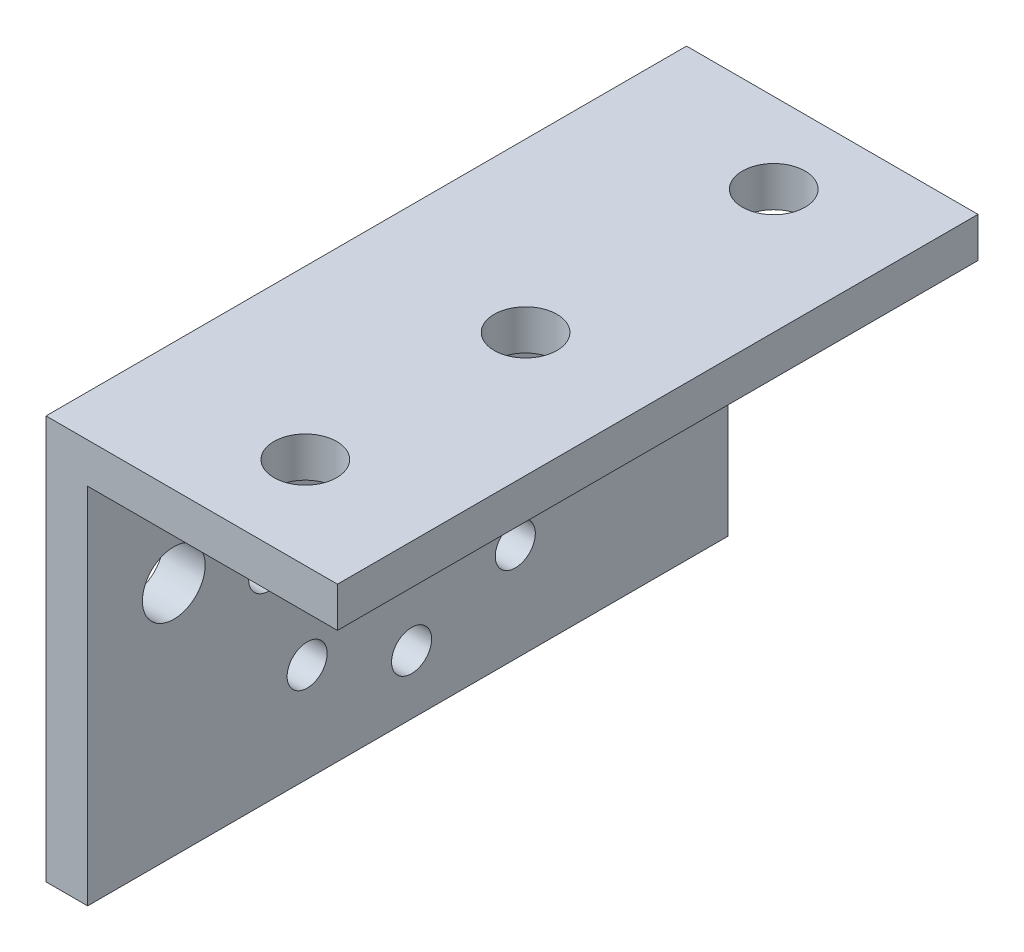
ISO-10303-21;
HEADER;
FILE_DESCRIPTION(('STEP AP214'),'2;1');
FILE_NAME('part.step','',(''),(''),'','','');
FILE_SCHEMA(('AUTOMOTIVE_DESIGN { 1 0 10303 214 1 1 1 1 }'));
ENDSEC;
DATA;
#1=APPLICATION_CONTEXT('core data for automotive mechanical design processes');
#2=APPLICATION_PROTOCOL_DEFINITION('international standard','automotive_design',2000,#1);
#3=PRODUCT_CONTEXT('',#1,'mechanical');
#4=PRODUCT('Part','Part','',(#3));
#5=PRODUCT_RELATED_PRODUCT_CATEGORY('part','',(#4));
#6=PRODUCT_DEFINITION_FORMATION('','',#4);
#7=PRODUCT_DEFINITION_CONTEXT('part definition',#1,'design');
#8=PRODUCT_DEFINITION('design','',#6,#7);
#9=PRODUCT_DEFINITION_SHAPE('','',#8);
#10=(LENGTH_UNIT() NAMED_UNIT(*) SI_UNIT(.MILLI.,.METRE.));
#11=(NAMED_UNIT(*) PLANE_ANGLE_UNIT() SI_UNIT($,.RADIAN.));
#12=(NAMED_UNIT(*) SI_UNIT($,.STERADIAN.) SOLID_ANGLE_UNIT());
#13=UNCERTAINTY_MEASURE_WITH_UNIT(LENGTH_MEASURE(1.E-05),#10,'distance_accuracy_value','');
#14=(GEOMETRIC_REPRESENTATION_CONTEXT(3) GLOBAL_UNCERTAINTY_ASSIGNED_CONTEXT((#13)) GLOBAL_UNIT_ASSIGNED_CONTEXT((#10,
#11,#12)) REPRESENTATION_CONTEXT('',''));
#15=CARTESIAN_POINT('',(0.,0.,0.));
#16=DIRECTION('',(0.,0.,1.));
#17=DIRECTION('',(1.,0.,0.));
#18=AXIS2_PLACEMENT_3D('',#15,#16,#17);
#19=CARTESIAN_POINT('',(0.,0.,50.8));
#20=DIRECTION('',(1.,0.,0.));
#21=DIRECTION('',(0.,0.,-1.));
#22=AXIS2_PLACEMENT_3D('',#19,#20,#21);
#23=PLANE('',#22);
#24=CARTESIAN_POINT('',(0.,27.3621465067313,25.1090568968444));
#25=DIRECTION('',(-1.,0.,0.));
#26=DIRECTION('',(0.,0.,1.));
#27=AXIS2_PLACEMENT_3D('',#24,#25,#26);
#28=CIRCLE('',#27,1.5875);
#29=CARTESIAN_POINT('',(0.,27.3621465067313,26.6965568968444));
#30=VERTEX_POINT('',#29);
#31=EDGE_CURVE('E170',#30,#30,#28,.T.);
#32=ORIENTED_EDGE('',*,*,#31,.F.);
#33=EDGE_LOOP('',(#32));
#34=FACE_BOUND('',#33,.T.);
#35=DIRECTION('',(0.,-1.,0.));
#36=VECTOR('',#35,1.);
#37=CARTESIAN_POINT('',(0.,0.,0.));
#38=LINE('',#37,#36);
#39=CARTESIAN_POINT('',(0.,32.004,0.));
#40=VERTEX_POINT('',#39);
#41=CARTESIAN_POINT('',(0.,0.,0.));
#42=VERTEX_POINT('',#41);
#43=EDGE_CURVE('E87',#40,#42,#38,.T.);
#44=ORIENTED_EDGE('',*,*,#43,.T.);
#45=DIRECTION('',(0.,0.,-1.));
#46=VECTOR('',#45,1.);
#47=CARTESIAN_POINT('',(0.,0.,50.8));
#48=LINE('',#47,#46);
#49=CARTESIAN_POINT('',(0.,0.,50.8));
#50=VERTEX_POINT('',#49);
#51=EDGE_CURVE('E128',#50,#42,#48,.T.);
#52=ORIENTED_EDGE('',*,*,#51,.F.);
#53=DIRECTION('',(0.,-1.,0.));
#54=VECTOR('',#53,1.);
#55=CARTESIAN_POINT('',(0.,0.,50.8));
#56=LINE('',#55,#54);
#57=CARTESIAN_POINT('',(0.,32.004,50.8));
#58=VERTEX_POINT('',#57);
#59=EDGE_CURVE('E60',#58,#50,#56,.T.);
#60=ORIENTED_EDGE('',*,*,#59,.F.);
#61=DIRECTION('',(0.,0.,-1.));
#62=VECTOR('',#61,1.);
#63=CARTESIAN_POINT('',(0.,32.004,50.8));
#64=LINE('',#63,#62);
#65=EDGE_CURVE('E124',#58,#40,#64,.T.);
#66=ORIENTED_EDGE('',*,*,#65,.T.);
#67=EDGE_LOOP('',(#44,#52,#60,#66));
#68=FACE_BOUND('',#67,.T.);
#69=CARTESIAN_POINT('',(0.,18.7616832923823,43.9669366542612));
#70=DIRECTION('',(-1.,0.,0.));
#71=DIRECTION('',(0.,0.,1.));
#72=AXIS2_PLACEMENT_3D('',#69,#70,#71);
#73=CIRCLE('',#72,2.4892);
#74=CARTESIAN_POINT('',(0.,18.7616832923823,46.4561366542612));
#75=VERTEX_POINT('',#74);
#76=EDGE_CURVE('E194',#75,#75,#73,.T.);
#77=ORIENTED_EDGE('',*,*,#76,.F.);
#78=EDGE_LOOP('',(#77));
#79=FACE_BOUND('',#78,.T.);
#80=CARTESIAN_POINT('',(0.,18.7616832923823,26.2056359254256));
#81=DIRECTION('',(-1.,0.,0.));
#82=DIRECTION('',(0.,0.,1.));
#83=AXIS2_PLACEMENT_3D('',#80,#81,#82);
#84=CIRCLE('',#83,2.4892);
#85=CARTESIAN_POINT('',(0.,18.7616832923823,28.6948359254256));
#86=VERTEX_POINT('',#85);
#87=EDGE_CURVE('E188',#86,#86,#84,.T.);
#88=ORIENTED_EDGE('',*,*,#87,.F.);
#89=EDGE_LOOP('',(#88));
#90=FACE_BOUND('',#89,.T.);
#91=CARTESIAN_POINT('',(0.,18.7616832923823,6.28968559997728));
#92=DIRECTION('',(-1.,0.,0.));
#93=DIRECTION('',(0.,0.,1.));
#94=AXIS2_PLACEMENT_3D('',#91,#92,#93);
#95=CIRCLE('',#94,2.4892);
#96=CARTESIAN_POINT('',(0.,18.7616832923823,8.77888559997728));
#97=VERTEX_POINT('',#96);
#98=EDGE_CURVE('E182',#97,#97,#95,.T.);
#99=ORIENTED_EDGE('',*,*,#98,.F.);
#100=EDGE_LOOP('',(#99));
#101=FACE_BOUND('',#100,.T.);
#102=CARTESIAN_POINT('',(0.,24.2925650484884,33.3929914732565));
#103=DIRECTION('',(-1.,0.,0.));
#104=DIRECTION('',(0.,0.,1.));
#105=AXIS2_PLACEMENT_3D('',#102,#103,#104);
#106=CIRCLE('',#105,1.5875);
#107=CARTESIAN_POINT('',(0.,24.2925650484884,34.9804914732565));
#108=VERTEX_POINT('',#107);
#109=EDGE_CURVE('E169',#108,#108,#106,.T.);
#110=ORIENTED_EDGE('',*,*,#109,.F.);
#111=EDGE_LOOP('',(#110));
#112=FACE_BOUND('',#111,.T.);
#113=CARTESIAN_POINT('',(0.,24.2925650484884,16.8841527330909));
#114=DIRECTION('',(-1.,0.,0.));
#115=DIRECTION('',(0.,0.,1.));
#116=AXIS2_PLACEMENT_3D('',#113,#114,#115);
#117=CIRCLE('',#116,1.5875);
#118=CARTESIAN_POINT('',(0.,24.2925650484884,18.4716527330908));
#119=VERTEX_POINT('',#118);
#120=EDGE_CURVE('E303',#119,#119,#117,.T.);
#121=ORIENTED_EDGE('',*,*,#120,.F.);
#122=EDGE_LOOP('',(#121));
#123=FACE_BOUND('',#122,.T.);
#124=CARTESIAN_POINT('',(0.,16.0283072762958,13.7948944706284));
#125=DIRECTION('',(-1.,0.,0.));
#126=DIRECTION('',(0.,0.,1.));
#127=AXIS2_PLACEMENT_3D('',#124,#125,#126);
#128=CIRCLE('',#127,1.5875);
#129=CARTESIAN_POINT('',(0.,16.0283072762958,15.3823944706284));
#130=VERTEX_POINT('',#129);
#131=EDGE_CURVE('E307',#130,#130,#128,.T.);
#132=ORIENTED_EDGE('',*,*,#131,.F.);
#133=EDGE_LOOP('',(#132));
#134=FACE_BOUND('',#133,.T.);
#135=CARTESIAN_POINT('',(0.,7.84275672098125,16.8841527330909));
#136=DIRECTION('',(-1.,0.,0.));
#137=DIRECTION('',(0.,0.,1.));
#138=AXIS2_PLACEMENT_3D('',#135,#136,#137);
#139=CIRCLE('',#138,1.5875);
#140=CARTESIAN_POINT('',(0.,7.84275672098125,18.4716527330908));
#141=VERTEX_POINT('',#140);
#142=EDGE_CURVE('E311',#141,#141,#139,.T.);
#143=ORIENTED_EDGE('',*,*,#142,.F.);
#144=EDGE_LOOP('',(#143));
#145=FACE_BOUND('',#144,.T.);
#146=CARTESIAN_POINT('',(0.,4.69446804586027,25.1090568968444));
#147=DIRECTION('',(-1.,0.,0.));
#148=DIRECTION('',(0.,0.,1.));
#149=AXIS2_PLACEMENT_3D('',#146,#147,#148);
#150=CIRCLE('',#149,1.5875);
#151=CARTESIAN_POINT('',(0.,4.69446804586027,26.6965568968444));
#152=VERTEX_POINT('',#151);
#153=EDGE_CURVE('E315',#152,#152,#150,.T.);
#154=ORIENTED_EDGE('',*,*,#153,.F.);
#155=EDGE_LOOP('',(#154));
#156=FACE_BOUND('',#155,.T.);
#157=CARTESIAN_POINT('',(0.,7.84275672098125,33.3929914732565));
#158=DIRECTION('',(-1.,0.,0.));
#159=DIRECTION('',(0.,0.,1.));
#160=AXIS2_PLACEMENT_3D('',#157,#158,#159);
#161=CIRCLE('',#160,1.5875);
#162=CARTESIAN_POINT('',(0.,7.84275672098125,34.9804914732565));
#163=VERTEX_POINT('',#162);
#164=EDGE_CURVE('E319',#163,#163,#161,.T.);
#165=ORIENTED_EDGE('',*,*,#164,.F.);
#166=EDGE_LOOP('',(#165));
#167=FACE_BOUND('',#166,.T.);
#168=CARTESIAN_POINT('',(0.,16.0283072762958,36.4428961272799));
#169=DIRECTION('',(-1.,0.,0.));
#170=DIRECTION('',(0.,0.,1.));
#171=AXIS2_PLACEMENT_3D('',#168,#169,#170);
#172=CIRCLE('',#171,1.5875);
#173=CARTESIAN_POINT('',(0.,16.0283072762958,38.0303961272799));
#174=VERTEX_POINT('',#173);
#175=EDGE_CURVE('E322',#174,#174,#172,.T.);
#176=ORIENTED_EDGE('',*,*,#175,.F.);
#177=EDGE_LOOP('',(#176));
#178=FACE_BOUND('',#177,.T.);
#179=ADVANCED_FACE('F37',(#34,#68,#79,#90,#101,#112,#123,#134,#145,#156,#167,#178),#23,.F.);
#180=CARTESIAN_POINT('',(0.,0.,50.8));
#181=DIRECTION('',(0.,1.,0.));
#182=DIRECTION('',(0.,0.,1.));
#183=AXIS2_PLACEMENT_3D('',#180,#181,#182);
#184=PLANE('',#183);
#185=DIRECTION('',(1.,0.,0.));
#186=VECTOR('',#185,1.);
#187=CARTESIAN_POINT('',(0.,0.,0.));
#188=LINE('',#187,#186);
#189=CARTESIAN_POINT('',(3.302,0.,0.));
#190=VERTEX_POINT('',#189);
#191=EDGE_CURVE('E132',#42,#190,#188,.T.);
#192=ORIENTED_EDGE('',*,*,#191,.T.);
#193=DIRECTION('',(0.,0.,-1.));
#194=VECTOR('',#193,1.);
#195=CARTESIAN_POINT('',(3.302,0.,50.8));
#196=LINE('',#195,#194);
#197=CARTESIAN_POINT('',(3.302,0.,50.8));
#198=VERTEX_POINT('',#197);
#199=EDGE_CURVE('E45',#198,#190,#196,.T.);
#200=ORIENTED_EDGE('',*,*,#199,.F.);
#201=DIRECTION('',(1.,0.,0.));
#202=VECTOR('',#201,1.);
#203=CARTESIAN_POINT('',(0.,0.,50.8));
#204=LINE('',#203,#202);
#205=EDGE_CURVE('E145',#50,#198,#204,.T.);
#206=ORIENTED_EDGE('',*,*,#205,.F.);
#207=ORIENTED_EDGE('',*,*,#51,.T.);
#208=EDGE_LOOP('',(#192,#200,#206,#207));
#209=FACE_BOUND('',#208,.T.);
#210=ADVANCED_FACE('F39',(#209),#184,.F.);
#211=CARTESIAN_POINT('',(3.302,0.,50.8));
#212=DIRECTION('',(-1.,0.,0.));
#213=DIRECTION('',(0.,0.,1.));
#214=AXIS2_PLACEMENT_3D('',#211,#212,#213);
#215=PLANE('',#214);
#216=CARTESIAN_POINT('',(3.302,16.0283072762958,36.4428961272799));
#217=DIRECTION('',(-1.,0.,0.));
#218=DIRECTION('',(0.,0.,1.));
#219=AXIS2_PLACEMENT_3D('',#216,#217,#218);
#220=CIRCLE('',#219,1.5875);
#221=CARTESIAN_POINT('',(3.302,16.0283072762958,38.0303961272799));
#222=VERTEX_POINT('',#221);
#223=EDGE_CURVE('E258',#222,#222,#220,.T.);
#224=ORIENTED_EDGE('',*,*,#223,.T.);
#225=EDGE_LOOP('',(#224));
#226=FACE_BOUND('',#225,.T.);
#227=CARTESIAN_POINT('',(3.302,7.84275672098125,33.3929914732565));
#228=DIRECTION('',(-1.,0.,0.));
#229=DIRECTION('',(0.,0.,1.));
#230=AXIS2_PLACEMENT_3D('',#227,#228,#229);
#231=CIRCLE('',#230,1.5875);
#232=CARTESIAN_POINT('',(3.302,7.84275672098125,34.9804914732565));
#233=VERTEX_POINT('',#232);
#234=EDGE_CURVE('E262',#233,#233,#231,.T.);
#235=ORIENTED_EDGE('',*,*,#234,.T.);
#236=EDGE_LOOP('',(#235));
#237=FACE_BOUND('',#236,.T.);
#238=CARTESIAN_POINT('',(3.302,4.69446804586027,25.1090568968444));
#239=DIRECTION('',(-1.,0.,0.));
#240=DIRECTION('',(0.,0.,1.));
#241=AXIS2_PLACEMENT_3D('',#238,#239,#240);
#242=CIRCLE('',#241,1.5875);
#243=CARTESIAN_POINT('',(3.302,4.69446804586027,26.6965568968444));
#244=VERTEX_POINT('',#243);
#245=EDGE_CURVE('E266',#244,#244,#242,.T.);
#246=ORIENTED_EDGE('',*,*,#245,.T.);
#247=EDGE_LOOP('',(#246));
#248=FACE_BOUND('',#247,.T.);
#249=CARTESIAN_POINT('',(3.302,7.84275672098125,16.8841527330909));
#250=DIRECTION('',(-1.,0.,0.));
#251=DIRECTION('',(0.,0.,1.));
#252=AXIS2_PLACEMENT_3D('',#249,#250,#251);
#253=CIRCLE('',#252,1.5875);
#254=CARTESIAN_POINT('',(3.302,7.84275672098125,18.4716527330908));
#255=VERTEX_POINT('',#254);
#256=EDGE_CURVE('E270',#255,#255,#253,.T.);
#257=ORIENTED_EDGE('',*,*,#256,.T.);
#258=EDGE_LOOP('',(#257));
#259=FACE_BOUND('',#258,.T.);
#260=CARTESIAN_POINT('',(3.302,16.0283072762958,13.7948944706284));
#261=DIRECTION('',(-1.,0.,0.));
#262=DIRECTION('',(0.,0.,1.));
#263=AXIS2_PLACEMENT_3D('',#260,#261,#262);
#264=CIRCLE('',#263,1.5875);
#265=CARTESIAN_POINT('',(3.302,16.0283072762958,15.3823944706284));
#266=VERTEX_POINT('',#265);
#267=EDGE_CURVE('E274',#266,#266,#264,.T.);
#268=ORIENTED_EDGE('',*,*,#267,.T.);
#269=EDGE_LOOP('',(#268));
#270=FACE_BOUND('',#269,.T.);
#271=CARTESIAN_POINT('',(3.302,24.2925650484884,16.8841527330909));
#272=DIRECTION('',(-1.,0.,0.));
#273=DIRECTION('',(0.,0.,1.));
#274=AXIS2_PLACEMENT_3D('',#271,#272,#273);
#275=CIRCLE('',#274,1.5875);
#276=CARTESIAN_POINT('',(3.302,24.2925650484884,18.4716527330908));
#277=VERTEX_POINT('',#276);
#278=EDGE_CURVE('E176',#277,#277,#275,.T.);
#279=ORIENTED_EDGE('',*,*,#278,.T.);
#280=EDGE_LOOP('',(#279));
#281=FACE_BOUND('',#280,.T.);
#282=CARTESIAN_POINT('',(3.302,24.2925650484884,33.3929914732565));
#283=DIRECTION('',(-1.,0.,0.));
#284=DIRECTION('',(0.,0.,1.));
#285=AXIS2_PLACEMENT_3D('',#282,#283,#284);
#286=CIRCLE('',#285,1.5875);
#287=CARTESIAN_POINT('',(3.302,24.2925650484884,34.9804914732565));
#288=VERTEX_POINT('',#287);
#289=EDGE_CURVE('E173',#288,#288,#286,.T.);
#290=ORIENTED_EDGE('',*,*,#289,.T.);
#291=EDGE_LOOP('',(#290));
#292=FACE_BOUND('',#291,.T.);
#293=CARTESIAN_POINT('',(3.302,18.7616832923823,6.28968559997728));
#294=DIRECTION('',(-1.,0.,0.));
#295=DIRECTION('',(0.,0.,1.));
#296=AXIS2_PLACEMENT_3D('',#293,#294,#295);
#297=CIRCLE('',#296,2.4892);
#298=CARTESIAN_POINT('',(3.302,18.7616832923823,8.77888559997728));
#299=VERTEX_POINT('',#298);
#300=EDGE_CURVE('E185',#299,#299,#297,.T.);
#301=ORIENTED_EDGE('',*,*,#300,.T.);
#302=EDGE_LOOP('',(#301));
#303=FACE_BOUND('',#302,.T.);
#304=CARTESIAN_POINT('',(3.302,18.7616832923823,26.2056359254256));
#305=DIRECTION('',(-1.,0.,0.));
#306=DIRECTION('',(0.,0.,1.));
#307=AXIS2_PLACEMENT_3D('',#304,#305,#306);
#308=CIRCLE('',#307,2.4892);
#309=CARTESIAN_POINT('',(3.302,18.7616832923823,28.6948359254256));
#310=VERTEX_POINT('',#309);
#311=EDGE_CURVE('E191',#310,#310,#308,.T.);
#312=ORIENTED_EDGE('',*,*,#311,.T.);
#313=EDGE_LOOP('',(#312));
#314=FACE_BOUND('',#313,.T.);
#315=CARTESIAN_POINT('',(3.302,18.7616832923823,43.9669366542612));
#316=DIRECTION('',(-1.,0.,0.));
#317=DIRECTION('',(0.,0.,1.));
#318=AXIS2_PLACEMENT_3D('',#315,#316,#317);
#319=CIRCLE('',#318,2.4892);
#320=CARTESIAN_POINT('',(3.302,18.7616832923823,46.4561366542612));
#321=VERTEX_POINT('',#320);
#322=EDGE_CURVE('E197',#321,#321,#319,.T.);
#323=ORIENTED_EDGE('',*,*,#322,.T.);
#324=EDGE_LOOP('',(#323));
#325=FACE_BOUND('',#324,.T.);
#326=DIRECTION('',(0.,0.,-1.));
#327=VECTOR('',#326,1.);
#328=CARTESIAN_POINT('',(3.302,28.829,50.8));
#329=LINE('',#328,#327);
#330=CARTESIAN_POINT('',(3.302,28.829,24.502017294112));
#331=VERTEX_POINT('',#330);
#332=CARTESIAN_POINT('',(3.302,28.829,0.));
#333=VERTEX_POINT('',#332);
#334=EDGE_CURVE('E149',#331,#333,#329,.T.);
#335=ORIENTED_EDGE('',*,*,#334,.F.);
#336=CARTESIAN_POINT('',(3.302,27.3621465067313,25.1090568968444));
#337=DIRECTION('',(-1.,0.,0.));
#338=DIRECTION('',(0.,0.,1.));
#339=AXIS2_PLACEMENT_3D('',#336,#337,#338);
#340=CIRCLE('',#339,1.5875);
#341=CARTESIAN_POINT('',(3.302,28.829,25.7160964995768));
#342=VERTEX_POINT('',#341);
#343=EDGE_CURVE('E11',#331,#342,#340,.T.);
#344=ORIENTED_EDGE('',*,*,#343,.T.);
#345=CARTESIAN_POINT('',(3.302,28.829,50.8));
#346=VERTEX_POINT('',#345);
#347=EDGE_CURVE('E150',#346,#342,#329,.T.);
#348=ORIENTED_EDGE('',*,*,#347,.F.);
#349=DIRECTION('',(0.,1.,0.));
#350=VECTOR('',#349,1.);
#351=CARTESIAN_POINT('',(3.302,0.,50.8));
#352=LINE('',#351,#350);
#353=EDGE_CURVE('E96',#198,#346,#352,.T.);
#354=ORIENTED_EDGE('',*,*,#353,.F.);
#355=ORIENTED_EDGE('',*,*,#199,.T.);
#356=DIRECTION('',(0.,1.,0.));
#357=VECTOR('',#356,1.);
#358=CARTESIAN_POINT('',(3.302,0.,0.));
#359=LINE('',#358,#357);
#360=EDGE_CURVE('E135',#190,#333,#359,.T.);
#361=ORIENTED_EDGE('',*,*,#360,.T.);
#362=EDGE_LOOP('',(#335,#344,#348,#354,#355,#361));
#363=FACE_BOUND('',#362,.T.);
#364=ADVANCED_FACE('F155',(#226,#237,#248,#259,#270,#281,#292,#303,#314,#325,#363),#215,.F.);
#365=CARTESIAN_POINT('',(3.302,28.829,50.8));
#366=DIRECTION('',(0.,1.,0.));
#367=DIRECTION('',(0.,0.,1.));
#368=AXIS2_PLACEMENT_3D('',#365,#366,#367);
#369=PLANE('',#368);
#370=CARTESIAN_POINT('',(13.2808123945746,28.829,26.0465703463184));
#371=DIRECTION('',(0.,1.,0.));
#372=DIRECTION('',(0.,0.,1.));
#373=AXIS2_PLACEMENT_3D('',#370,#371,#372);
#374=CIRCLE('',#373,2.48919999999999);
#375=CARTESIAN_POINT('',(13.2808123945746,28.829,28.5357703463184));
#376=VERTEX_POINT('',#375);
#377=EDGE_CURVE('E203',#376,#376,#374,.T.);
#378=ORIENTED_EDGE('',*,*,#377,.T.);
#379=EDGE_LOOP('',(#378));
#380=FACE_BOUND('',#379,.T.);
#381=CARTESIAN_POINT('',(13.2808123945746,28.829,6.36620796512664));
#382=DIRECTION('',(0.,1.,0.));
#383=DIRECTION('',(0.,0.,1.));
#384=AXIS2_PLACEMENT_3D('',#381,#382,#383);
#385=CIRCLE('',#384,2.48919999999999);
#386=CARTESIAN_POINT('',(13.2808123945746,28.829,8.85540796512663));
#387=VERTEX_POINT('',#386);
#388=EDGE_CURVE('E209',#387,#387,#385,.T.);
#389=ORIENTED_EDGE('',*,*,#388,.T.);
#390=EDGE_LOOP('',(#389));
#391=FACE_BOUND('',#390,.T.);
#392=CARTESIAN_POINT('',(13.2808123945746,28.829,43.5140690147923));
#393=DIRECTION('',(0.,1.,0.));
#394=DIRECTION('',(0.,0.,1.));
#395=AXIS2_PLACEMENT_3D('',#392,#393,#394);
#396=CIRCLE('',#395,2.48919999999999);
#397=CARTESIAN_POINT('',(13.2808123945746,28.829,46.0032690147923));
#398=VERTEX_POINT('',#397);
#399=EDGE_CURVE('E136',#398,#398,#396,.T.);
#400=ORIENTED_EDGE('',*,*,#399,.T.);
#401=EDGE_LOOP('',(#400));
#402=FACE_BOUND('',#401,.T.);
#403=DIRECTION('',(1.,0.,0.));
#404=VECTOR('',#403,1.);
#405=CARTESIAN_POINT('',(3.302,28.829,0.));
#406=LINE('',#405,#404);
#407=CARTESIAN_POINT('',(23.114,28.829,0.));
#408=VERTEX_POINT('',#407);
#409=EDGE_CURVE('E139',#333,#408,#406,.T.);
#410=ORIENTED_EDGE('',*,*,#409,.T.);
#411=DIRECTION('',(0.,0.,-1.));
#412=VECTOR('',#411,1.);
#413=CARTESIAN_POINT('',(23.114,28.829,50.8));
#414=LINE('',#413,#412);
#415=CARTESIAN_POINT('',(23.114,28.829,50.8));
#416=VERTEX_POINT('',#415);
#417=EDGE_CURVE('E123',#416,#408,#414,.T.);
#418=ORIENTED_EDGE('',*,*,#417,.F.);
#419=DIRECTION('',(1.,0.,0.));
#420=VECTOR('',#419,1.);
#421=CARTESIAN_POINT('',(3.302,28.829,50.8));
#422=LINE('',#421,#420);
#423=EDGE_CURVE('E111',#346,#416,#422,.T.);
#424=ORIENTED_EDGE('',*,*,#423,.F.);
#425=ORIENTED_EDGE('',*,*,#347,.T.);
#426=EDGE_CURVE('E152',#342,#331,#329,.T.);
#427=ORIENTED_EDGE('',*,*,#426,.T.);
#428=ORIENTED_EDGE('',*,*,#334,.T.);
#429=EDGE_LOOP('',(#410,#418,#424,#425,#427,#428));
#430=FACE_BOUND('',#429,.T.);
#431=ADVANCED_FACE('F163',(#380,#391,#402,#430),#369,.F.);
#432=CARTESIAN_POINT('',(23.114,32.004,50.8));
#433=DIRECTION('',(-1.,0.,0.));
#434=DIRECTION('',(0.,0.,1.));
#435=AXIS2_PLACEMENT_3D('',#432,#433,#434);
#436=PLANE('',#435);
#437=DIRECTION('',(0.,1.,0.));
#438=VECTOR('',#437,1.);
#439=CARTESIAN_POINT('',(23.114,32.004,0.));
#440=LINE('',#439,#438);
#441=CARTESIAN_POINT('',(23.114,32.004,0.));
#442=VERTEX_POINT('',#441);
#443=EDGE_CURVE('E120',#408,#442,#440,.T.);
#444=ORIENTED_EDGE('',*,*,#443,.T.);
#445=DIRECTION('',(0.,0.,-1.));
#446=VECTOR('',#445,1.);
#447=CARTESIAN_POINT('',(23.114,32.004,50.8));
#448=LINE('',#447,#446);
#449=CARTESIAN_POINT('',(23.114,32.004,50.8));
#450=VERTEX_POINT('',#449);
#451=EDGE_CURVE('E117',#450,#442,#448,.T.);
#452=ORIENTED_EDGE('',*,*,#451,.F.);
#453=DIRECTION('',(0.,1.,0.));
#454=VECTOR('',#453,1.);
#455=CARTESIAN_POINT('',(23.114,32.004,50.8));
#456=LINE('',#455,#454);
#457=EDGE_CURVE('E104',#416,#450,#456,.T.);
#458=ORIENTED_EDGE('',*,*,#457,.F.);
#459=ORIENTED_EDGE('',*,*,#417,.T.);
#460=EDGE_LOOP('',(#444,#452,#458,#459));
#461=FACE_BOUND('',#460,.T.);
#462=ADVANCED_FACE('F118',(#461),#436,.F.);
#463=CARTESIAN_POINT('',(0.,32.004,50.8));
#464=DIRECTION('',(0.,-1.,0.));
#465=DIRECTION('',(0.,0.,-1.));
#466=AXIS2_PLACEMENT_3D('',#463,#464,#465);
#467=PLANE('',#466);
#468=CARTESIAN_POINT('',(13.2808123945746,32.004,26.0465703463184));
#469=DIRECTION('',(0.,1.,0.));
#470=DIRECTION('',(0.,0.,1.));
#471=AXIS2_PLACEMENT_3D('',#468,#469,#470);
#472=CIRCLE('',#471,2.48919999999999);
#473=CARTESIAN_POINT('',(13.2808123945746,32.004,28.5357703463184));
#474=VERTEX_POINT('',#473);
#475=EDGE_CURVE('E200',#474,#474,#472,.T.);
#476=ORIENTED_EDGE('',*,*,#475,.F.);
#477=EDGE_LOOP('',(#476));
#478=FACE_BOUND('',#477,.T.);
#479=CARTESIAN_POINT('',(13.2808123945746,32.004,6.36620796512664));
#480=DIRECTION('',(0.,1.,0.));
#481=DIRECTION('',(0.,0.,1.));
#482=AXIS2_PLACEMENT_3D('',#479,#480,#481);
#483=CIRCLE('',#482,2.48919999999999);
#484=CARTESIAN_POINT('',(13.2808123945746,32.004,8.85540796512663));
#485=VERTEX_POINT('',#484);
#486=EDGE_CURVE('E206',#485,#485,#483,.T.);
#487=ORIENTED_EDGE('',*,*,#486,.F.);
#488=EDGE_LOOP('',(#487));
#489=FACE_BOUND('',#488,.T.);
#490=CARTESIAN_POINT('',(13.2808123945746,32.004,43.5140690147923));
#491=DIRECTION('',(0.,1.,0.));
#492=DIRECTION('',(0.,0.,1.));
#493=AXIS2_PLACEMENT_3D('',#490,#491,#492);
#494=CIRCLE('',#493,2.48919999999999);
#495=CARTESIAN_POINT('',(13.2808123945746,32.004,46.0032690147923));
#496=VERTEX_POINT('',#495);
#497=EDGE_CURVE('E212',#496,#496,#494,.T.);
#498=ORIENTED_EDGE('',*,*,#497,.F.);
#499=EDGE_LOOP('',(#498));
#500=FACE_BOUND('',#499,.T.);
#501=DIRECTION('',(-1.,0.,0.));
#502=VECTOR('',#501,1.);
#503=CARTESIAN_POINT('',(0.,32.004,0.));
#504=LINE('',#503,#502);
#505=EDGE_CURVE('E142',#442,#40,#504,.T.);
#506=ORIENTED_EDGE('',*,*,#505,.T.);
#507=ORIENTED_EDGE('',*,*,#65,.F.);
#508=DIRECTION('',(-1.,0.,0.));
#509=VECTOR('',#508,1.);
#510=CARTESIAN_POINT('',(0.,32.004,50.8));
#511=LINE('',#510,#509);
#512=EDGE_CURVE('E108',#450,#58,#511,.T.);
#513=ORIENTED_EDGE('',*,*,#512,.F.);
#514=ORIENTED_EDGE('',*,*,#451,.T.);
#515=EDGE_LOOP('',(#506,#507,#513,#514));
#516=FACE_BOUND('',#515,.T.);
#517=ADVANCED_FACE('F126',(#478,#489,#500,#516),#467,.F.);
#518=CARTESIAN_POINT('',(0.,0.,50.8));
#519=DIRECTION('',(0.,0.,1.));
#520=DIRECTION('',(1.,0.,0.));
#521=AXIS2_PLACEMENT_3D('',#518,#519,#520);
#522=PLANE('',#521);
#523=ORIENTED_EDGE('',*,*,#205,.T.);
#524=ORIENTED_EDGE('',*,*,#353,.T.);
#525=ORIENTED_EDGE('',*,*,#423,.T.);
#526=ORIENTED_EDGE('',*,*,#457,.T.);
#527=ORIENTED_EDGE('',*,*,#512,.T.);
#528=ORIENTED_EDGE('',*,*,#59,.T.);
#529=EDGE_LOOP('',(#523,#524,#525,#526,#527,#528));
#530=FACE_BOUND('',#529,.T.);
#531=ADVANCED_FACE('F106',(#530),#522,.T.);
#532=CARTESIAN_POINT('',(0.,0.,0.));
#533=DIRECTION('',(0.,0.,1.));
#534=DIRECTION('',(1.,0.,0.));
#535=AXIS2_PLACEMENT_3D('',#532,#533,#534);
#536=PLANE('',#535);
#537=ORIENTED_EDGE('',*,*,#191,.F.);
#538=ORIENTED_EDGE('',*,*,#43,.F.);
#539=ORIENTED_EDGE('',*,*,#505,.F.);
#540=ORIENTED_EDGE('',*,*,#443,.F.);
#541=ORIENTED_EDGE('',*,*,#409,.F.);
#542=ORIENTED_EDGE('',*,*,#360,.F.);
#543=EDGE_LOOP('',(#537,#538,#539,#540,#541,#542));
#544=FACE_BOUND('',#543,.T.);
#545=ADVANCED_FACE('F161',(#544),#536,.F.);
#546=CARTESIAN_POINT('',(13.2808123945746,32.004,43.5140690147923));
#547=DIRECTION('',(0.,1.,0.));
#548=DIRECTION('',(0.,0.,1.));
#549=AXIS2_PLACEMENT_3D('',#546,#547,#548);
#550=CYLINDRICAL_SURFACE('',#549,2.48919999999999);
#551=ORIENTED_EDGE('',*,*,#497,.T.);
#552=EDGE_LOOP('',(#551));
#553=FACE_BOUND('',#552,.T.);
#554=ORIENTED_EDGE('',*,*,#399,.F.);
#555=EDGE_LOOP('',(#554));
#556=FACE_BOUND('',#555,.T.);
#557=ADVANCED_FACE('F221',(#553,#556),#550,.F.);
#558=CARTESIAN_POINT('',(13.2808123945746,32.004,6.36620796512664));
#559=DIRECTION('',(0.,1.,0.));
#560=DIRECTION('',(0.,0.,1.));
#561=AXIS2_PLACEMENT_3D('',#558,#559,#560);
#562=CYLINDRICAL_SURFACE('',#561,2.48919999999999);
#563=ORIENTED_EDGE('',*,*,#486,.T.);
#564=EDGE_LOOP('',(#563));
#565=FACE_BOUND('',#564,.T.);
#566=ORIENTED_EDGE('',*,*,#388,.F.);
#567=EDGE_LOOP('',(#566));
#568=FACE_BOUND('',#567,.T.);
#569=ADVANCED_FACE('F223',(#565,#568),#562,.F.);
#570=CARTESIAN_POINT('',(13.2808123945746,32.004,26.0465703463184));
#571=DIRECTION('',(0.,1.,0.));
#572=DIRECTION('',(0.,0.,1.));
#573=AXIS2_PLACEMENT_3D('',#570,#571,#572);
#574=CYLINDRICAL_SURFACE('',#573,2.48919999999999);
#575=ORIENTED_EDGE('',*,*,#475,.T.);
#576=EDGE_LOOP('',(#575));
#577=FACE_BOUND('',#576,.T.);
#578=ORIENTED_EDGE('',*,*,#377,.F.);
#579=EDGE_LOOP('',(#578));
#580=FACE_BOUND('',#579,.T.);
#581=ADVANCED_FACE('F230',(#577,#580),#574,.F.);
#582=CARTESIAN_POINT('',(0.,18.7616832923823,43.9669366542612));
#583=DIRECTION('',(-1.,0.,0.));
#584=DIRECTION('',(0.,0.,1.));
#585=AXIS2_PLACEMENT_3D('',#582,#583,#584);
#586=CYLINDRICAL_SURFACE('',#585,2.4892);
#587=ORIENTED_EDGE('',*,*,#322,.F.);
#588=EDGE_LOOP('',(#587));
#589=FACE_BOUND('',#588,.T.);
#590=ORIENTED_EDGE('',*,*,#76,.T.);
#591=EDGE_LOOP('',(#590));
#592=FACE_BOUND('',#591,.T.);
#593=ADVANCED_FACE('F286',(#589,#592),#586,.F.);
#594=CARTESIAN_POINT('',(0.,18.7616832923823,26.2056359254256));
#595=DIRECTION('',(-1.,0.,0.));
#596=DIRECTION('',(0.,0.,1.));
#597=AXIS2_PLACEMENT_3D('',#594,#595,#596);
#598=CYLINDRICAL_SURFACE('',#597,2.4892);
#599=ORIENTED_EDGE('',*,*,#311,.F.);
#600=EDGE_LOOP('',(#599));
#601=FACE_BOUND('',#600,.T.);
#602=ORIENTED_EDGE('',*,*,#87,.T.);
#603=EDGE_LOOP('',(#602));
#604=FACE_BOUND('',#603,.T.);
#605=ADVANCED_FACE('F289',(#601,#604),#598,.F.);
#606=CARTESIAN_POINT('',(0.,18.7616832923823,6.28968559997728));
#607=DIRECTION('',(-1.,0.,0.));
#608=DIRECTION('',(0.,0.,1.));
#609=AXIS2_PLACEMENT_3D('',#606,#607,#608);
#610=CYLINDRICAL_SURFACE('',#609,2.4892);
#611=ORIENTED_EDGE('',*,*,#300,.F.);
#612=EDGE_LOOP('',(#611));
#613=FACE_BOUND('',#612,.T.);
#614=ORIENTED_EDGE('',*,*,#98,.T.);
#615=EDGE_LOOP('',(#614));
#616=FACE_BOUND('',#615,.T.);
#617=ADVANCED_FACE('F356',(#613,#616),#610,.F.);
#618=CARTESIAN_POINT('',(0.,24.2925650484884,33.3929914732565));
#619=DIRECTION('',(-1.,0.,0.));
#620=DIRECTION('',(0.,0.,1.));
#621=AXIS2_PLACEMENT_3D('',#618,#619,#620);
#622=CYLINDRICAL_SURFACE('',#621,1.5875);
#623=ORIENTED_EDGE('',*,*,#289,.F.);
#624=EDGE_LOOP('',(#623));
#625=FACE_BOUND('',#624,.T.);
#626=ORIENTED_EDGE('',*,*,#109,.T.);
#627=EDGE_LOOP('',(#626));
#628=FACE_BOUND('',#627,.T.);
#629=ADVANCED_FACE('F353',(#625,#628),#622,.F.);
#630=CARTESIAN_POINT('',(0.,27.3621465067313,25.1090568968444));
#631=DIRECTION('',(-1.,0.,0.));
#632=DIRECTION('',(0.,0.,1.));
#633=AXIS2_PLACEMENT_3D('',#630,#631,#632);
#634=CYLINDRICAL_SURFACE('',#633,1.5875);
#635=CARTESIAN_POINT('',(3.302,27.3621465067313,25.1090568968444));
#636=DIRECTION('',(-1.,0.,0.));
#637=DIRECTION('',(0.,0.,1.));
#638=AXIS2_PLACEMENT_3D('',#635,#636,#637);
#639=CIRCLE('',#638,1.5875);
#640=EDGE_CURVE('E51',#331,#342,#639,.F.);
#641=ORIENTED_EDGE('',*,*,#640,.T.);
#642=ORIENTED_EDGE('',*,*,#343,.F.);
#643=EDGE_LOOP('',(#641,#642));
#644=FACE_BOUND('',#643,.T.);
#645=ORIENTED_EDGE('',*,*,#31,.T.);
#646=EDGE_LOOP('',(#645));
#647=FACE_BOUND('',#646,.T.);
#648=ADVANCED_FACE('F165',(#644,#647),#634,.F.);
#649=CARTESIAN_POINT('',(3.302,0.,50.8));
#650=DIRECTION('',(-1.,0.,0.));
#651=DIRECTION('',(0.,0.,1.));
#652=AXIS2_PLACEMENT_3D('',#649,#650,#651);
#653=PLANE('',#652);
#654=ORIENTED_EDGE('',*,*,#640,.F.);
#655=ORIENTED_EDGE('',*,*,#426,.F.);
#656=EDGE_LOOP('',(#654,#655));
#657=FACE_BOUND('',#656,.T.);
#658=ADVANCED_FACE('F168',(#657),#653,.T.);
#659=CARTESIAN_POINT('',(0.,24.2925650484884,16.8841527330909));
#660=DIRECTION('',(-1.,0.,0.));
#661=DIRECTION('',(0.,0.,1.));
#662=AXIS2_PLACEMENT_3D('',#659,#660,#661);
#663=CYLINDRICAL_SURFACE('',#662,1.5875);
#664=ORIENTED_EDGE('',*,*,#278,.F.);
#665=EDGE_LOOP('',(#664));
#666=FACE_BOUND('',#665,.T.);
#667=ORIENTED_EDGE('',*,*,#120,.T.);
#668=EDGE_LOOP('',(#667));
#669=FACE_BOUND('',#668,.T.);
#670=ADVANCED_FACE('F336',(#666,#669),#663,.F.);
#671=CARTESIAN_POINT('',(0.,16.0283072762958,13.7948944706284));
#672=DIRECTION('',(-1.,0.,0.));
#673=DIRECTION('',(0.,0.,1.));
#674=AXIS2_PLACEMENT_3D('',#671,#672,#673);
#675=CYLINDRICAL_SURFACE('',#674,1.5875);
#676=ORIENTED_EDGE('',*,*,#267,.F.);
#677=EDGE_LOOP('',(#676));
#678=FACE_BOUND('',#677,.T.);
#679=ORIENTED_EDGE('',*,*,#131,.T.);
#680=EDGE_LOOP('',(#679));
#681=FACE_BOUND('',#680,.T.);
#682=ADVANCED_FACE('F338',(#678,#681),#675,.F.);
#683=CARTESIAN_POINT('',(0.,7.84275672098125,16.8841527330909));
#684=DIRECTION('',(-1.,0.,0.));
#685=DIRECTION('',(0.,0.,1.));
#686=AXIS2_PLACEMENT_3D('',#683,#684,#685);
#687=CYLINDRICAL_SURFACE('',#686,1.5875);
#688=ORIENTED_EDGE('',*,*,#256,.F.);
#689=EDGE_LOOP('',(#688));
#690=FACE_BOUND('',#689,.T.);
#691=ORIENTED_EDGE('',*,*,#142,.T.);
#692=EDGE_LOOP('',(#691));
#693=FACE_BOUND('',#692,.T.);
#694=ADVANCED_FACE('F345',(#690,#693),#687,.F.);
#695=CARTESIAN_POINT('',(0.,4.69446804586027,25.1090568968444));
#696=DIRECTION('',(-1.,0.,0.));
#697=DIRECTION('',(0.,0.,1.));
#698=AXIS2_PLACEMENT_3D('',#695,#696,#697);
#699=CYLINDRICAL_SURFACE('',#698,1.5875);
#700=ORIENTED_EDGE('',*,*,#245,.F.);
#701=EDGE_LOOP('',(#700));
#702=FACE_BOUND('',#701,.T.);
#703=ORIENTED_EDGE('',*,*,#153,.T.);
#704=EDGE_LOOP('',(#703));
#705=FACE_BOUND('',#704,.T.);
#706=ADVANCED_FACE('F430',(#702,#705),#699,.F.);
#707=CARTESIAN_POINT('',(0.,7.84275672098125,33.3929914732565));
#708=DIRECTION('',(-1.,0.,0.));
#709=DIRECTION('',(0.,0.,1.));
#710=AXIS2_PLACEMENT_3D('',#707,#708,#709);
#711=CYLINDRICAL_SURFACE('',#710,1.5875);
#712=ORIENTED_EDGE('',*,*,#234,.F.);
#713=EDGE_LOOP('',(#712));
#714=FACE_BOUND('',#713,.T.);
#715=ORIENTED_EDGE('',*,*,#164,.T.);
#716=EDGE_LOOP('',(#715));
#717=FACE_BOUND('',#716,.T.);
#718=ADVANCED_FACE('F440',(#714,#717),#711,.F.);
#719=CARTESIAN_POINT('',(0.,16.0283072762958,36.4428961272799));
#720=DIRECTION('',(-1.,0.,0.));
#721=DIRECTION('',(0.,0.,1.));
#722=AXIS2_PLACEMENT_3D('',#719,#720,#721);
#723=CYLINDRICAL_SURFACE('',#722,1.5875);
#724=ORIENTED_EDGE('',*,*,#223,.F.);
#725=EDGE_LOOP('',(#724));
#726=FACE_BOUND('',#725,.T.);
#727=ORIENTED_EDGE('',*,*,#175,.T.);
#728=EDGE_LOOP('',(#727));
#729=FACE_BOUND('',#728,.T.);
#730=ADVANCED_FACE('F451',(#726,#729),#723,.F.);
#731=CLOSED_SHELL('',(#179,#210,#364,#431,#462,#517,#531,#545,#557,#569,#581,#593,#605,#617,
#629,#648,#658,#670,#682,#694,#706,#718,#730));
#732=MANIFOLD_SOLID_BREP('B2',#731);
#733=ADVANCED_BREP_SHAPE_REPRESENTATION('',(#18,#732),#14);
#734=SHAPE_DEFINITION_REPRESENTATION(#9,#733);
ENDSEC;
END-ISO-10303-21;
